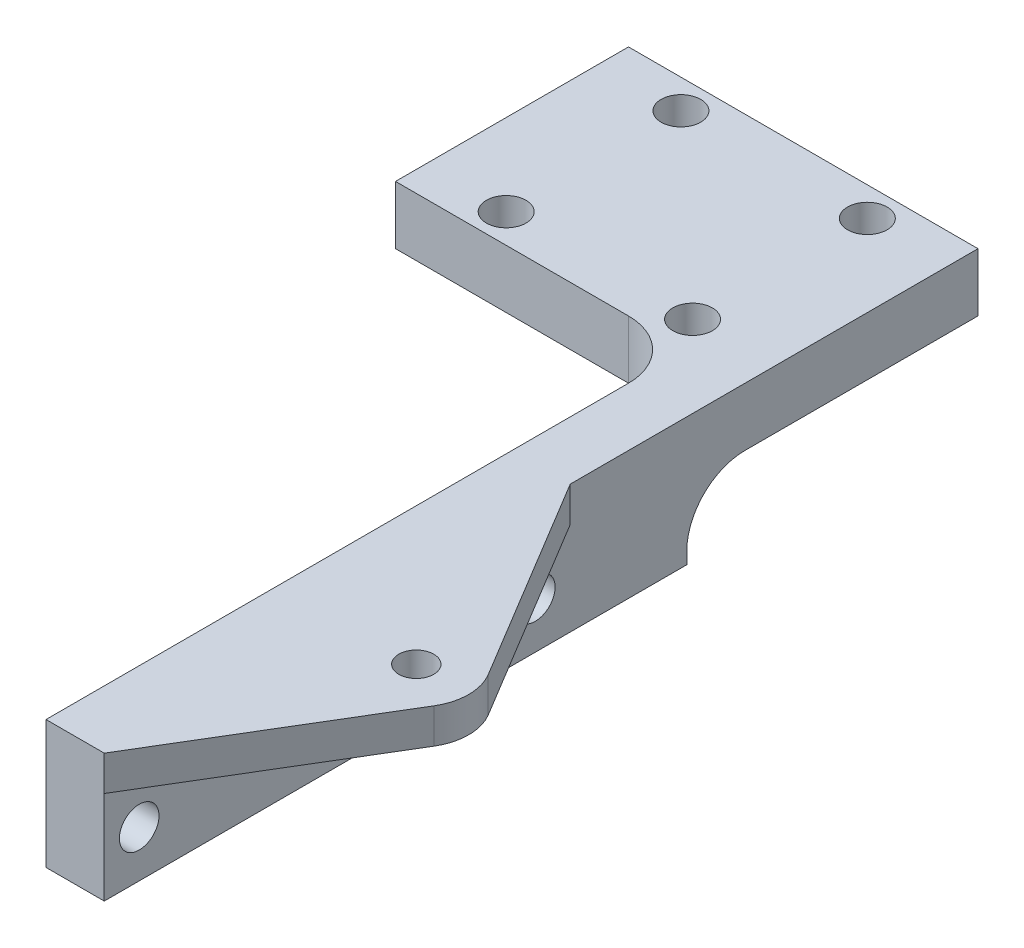
ISO-10303-21;
HEADER;
FILE_DESCRIPTION(('STEP AP214'),'2;1');
FILE_NAME('part.step','',(''),(''),'','','');
FILE_SCHEMA(('AUTOMOTIVE_DESIGN { 1 0 10303 214 1 1 1 1 }'));
ENDSEC;
DATA;
#1=APPLICATION_CONTEXT('core data for automotive mechanical design processes');
#2=APPLICATION_PROTOCOL_DEFINITION('international standard','automotive_design',2000,#1);
#3=PRODUCT_CONTEXT('',#1,'mechanical');
#4=PRODUCT('Part','Part','',(#3));
#5=PRODUCT_RELATED_PRODUCT_CATEGORY('part','',(#4));
#6=PRODUCT_DEFINITION_FORMATION('','',#4);
#7=PRODUCT_DEFINITION_CONTEXT('part definition',#1,'design');
#8=PRODUCT_DEFINITION('design','',#6,#7);
#9=PRODUCT_DEFINITION_SHAPE('','',#8);
#10=(LENGTH_UNIT() NAMED_UNIT(*) SI_UNIT(.MILLI.,.METRE.));
#11=(NAMED_UNIT(*) PLANE_ANGLE_UNIT() SI_UNIT($,.RADIAN.));
#12=(NAMED_UNIT(*) SI_UNIT($,.STERADIAN.) SOLID_ANGLE_UNIT());
#13=UNCERTAINTY_MEASURE_WITH_UNIT(LENGTH_MEASURE(1.E-05),#10,'distance_accuracy_value','');
#14=(GEOMETRIC_REPRESENTATION_CONTEXT(3) GLOBAL_UNCERTAINTY_ASSIGNED_CONTEXT((#13)) GLOBAL_UNIT_ASSIGNED_CONTEXT((#10,
#11,#12)) REPRESENTATION_CONTEXT('',''));
#15=CARTESIAN_POINT('',(0.,0.,0.));
#16=DIRECTION('',(0.,0.,1.));
#17=DIRECTION('',(1.,0.,0.));
#18=AXIS2_PLACEMENT_3D('',#15,#16,#17);
#19=CARTESIAN_POINT('',(5.,10.3579008868023,0.));
#20=DIRECTION('',(0.,1.,0.));
#21=DIRECTION('',(0.,0.,1.));
#22=AXIS2_PLACEMENT_3D('',#19,#20,#21);
#23=PLANE('',#22);
#24=DIRECTION('',(-1.,0.,0.));
#25=VECTOR('',#24,1.);
#26=CARTESIAN_POINT('',(5.,10.3579008868023,-13.0688163423994));
#27=LINE('',#26,#25);
#28=CARTESIAN_POINT('',(5.,10.3579008868023,-13.0688163423994));
#29=VERTEX_POINT('',#28);
#30=CARTESIAN_POINT('',(0.,10.3579008868023,-13.0688163423994));
#31=VERTEX_POINT('',#30);
#32=EDGE_CURVE('E191',#29,#31,#27,.T.);
#33=ORIENTED_EDGE('',*,*,#32,.F.);
#34=DIRECTION('',(0.,0.,-1.));
#35=VECTOR('',#34,1.);
#36=CARTESIAN_POINT('',(5.,10.3579008868023,0.));
#37=LINE('',#36,#35);
#38=CARTESIAN_POINT('',(5.,10.3579008868023,36.9311846261761));
#39=VERTEX_POINT('',#38);
#40=EDGE_CURVE('E278',#39,#29,#37,.T.);
#41=ORIENTED_EDGE('',*,*,#40,.F.);
#42=DIRECTION('',(-1.,0.,0.));
#43=VECTOR('',#42,1.);
#44=CARTESIAN_POINT('',(5.,10.3579008868023,36.9311846261761));
#45=LINE('',#44,#43);
#46=CARTESIAN_POINT('',(0.,10.3579008868023,36.9311846261761));
#47=VERTEX_POINT('',#46);
#48=EDGE_CURVE('E290',#39,#47,#45,.T.);
#49=ORIENTED_EDGE('',*,*,#48,.T.);
#50=DIRECTION('',(0.,0.,-1.));
#51=VECTOR('',#50,1.);
#52=CARTESIAN_POINT('',(0.,10.3579008868023,0.));
#53=LINE('',#52,#51);
#54=EDGE_CURVE('E297',#47,#31,#53,.T.);
#55=ORIENTED_EDGE('',*,*,#54,.T.);
#56=EDGE_LOOP('',(#33,#41,#49,#55));
#57=FACE_BOUND('',#56,.T.);
#58=ADVANCED_FACE('F45',(#57),#23,.F.);
#59=CARTESIAN_POINT('',(5.,21.3579008011206,0.));
#60=DIRECTION('',(0.,1.,0.));
#61=DIRECTION('',(0.,0.,1.));
#62=AXIS2_PLACEMENT_3D('',#59,#60,#61);
#63=PLANE('',#62);
#64=DIRECTION('',(0.,0.,-1.));
#65=VECTOR('',#64,1.);
#66=CARTESIAN_POINT('',(0.,21.3579008011206,0.));
#67=LINE('',#66,#65);
#68=CARTESIAN_POINT('',(0.,21.3579008011206,36.9311846261761));
#69=VERTEX_POINT('',#68);
#70=CARTESIAN_POINT('',(0.,21.3579008011206,-13.0688163423993));
#71=VERTEX_POINT('',#70);
#72=EDGE_CURVE('E266',#69,#71,#67,.T.);
#73=ORIENTED_EDGE('',*,*,#72,.F.);
#74=DIRECTION('',(-1.,0.,0.));
#75=VECTOR('',#74,1.);
#76=CARTESIAN_POINT('',(5.,21.3579008011206,36.9311846261761));
#77=LINE('',#76,#75);
#78=CARTESIAN_POINT('',(5.,21.3579008011206,36.9311846261761));
#79=VERTEX_POINT('',#78);
#80=EDGE_CURVE('E311',#79,#69,#77,.T.);
#81=ORIENTED_EDGE('',*,*,#80,.F.);
#82=DIRECTION('',(-0.515652830219382,0.,0.856797618277935));
#83=VECTOR('',#82,1.);
#84=CARTESIAN_POINT('',(19.9870817863266,21.3579008011206,12.0289728531929));
#85=LINE('',#84,#83);
#86=CARTESIAN_POINT('',(15.6402210901174,21.3579008011206,19.2516228091981));
#87=VERTEX_POINT('',#86);
#88=EDGE_CURVE('E176',#87,#79,#85,.T.);
#89=ORIENTED_EDGE('',*,*,#88,.F.);
#90=CARTESIAN_POINT('',(11.7846318078667,21.3579008011206,16.9311850732109));
#91=DIRECTION('',(0.,1.,0.));
#92=DIRECTION('',(0.,0.,1.));
#93=AXIS2_PLACEMENT_3D('',#90,#91,#92);
#94=CIRCLE('',#93,4.5);
#95=CARTESIAN_POINT('',(15.6402210901174,21.3579008011206,14.6107473372236));
#96=VERTEX_POINT('',#95);
#97=EDGE_CURVE('E143',#87,#96,#94,.T.);
#98=ORIENTED_EDGE('',*,*,#97,.T.);
#99=DIRECTION('',(-0.515652830219382,0.,-0.856797618277935));
#100=VECTOR('',#99,1.);
#101=CARTESIAN_POINT('',(5.02634407714158,21.3579008011206,-3.02504172950877));
#102=LINE('',#101,#100);
#103=CARTESIAN_POINT('',(5.,21.3579008011206,-3.06881447975438));
#104=VERTEX_POINT('',#103);
#105=EDGE_CURVE('E181',#96,#104,#102,.T.);
#106=ORIENTED_EDGE('',*,*,#105,.T.);
#107=DIRECTION('',(0.,0.,-1.));
#108=VECTOR('',#107,1.);
#109=CARTESIAN_POINT('',(5.,21.3579008011206,0.));
#110=LINE('',#109,#108);
#111=CARTESIAN_POINT('',(5.,21.3579008011206,-38.0688163423991));
#112=VERTEX_POINT('',#111);
#113=EDGE_CURVE('E68',#104,#112,#110,.T.);
#114=ORIENTED_EDGE('',*,*,#113,.T.);
#115=DIRECTION('',(-1.,0.,0.));
#116=VECTOR('',#115,1.);
#117=CARTESIAN_POINT('',(0.,21.3579008011206,-38.0688163423991));
#118=LINE('',#117,#116);
#119=CARTESIAN_POINT('',(-25.0000000000003,21.3579008011206,-38.0688163423991));
#120=VERTEX_POINT('',#119);
#121=EDGE_CURVE('E252',#112,#120,#118,.T.);
#122=ORIENTED_EDGE('',*,*,#121,.T.);
#123=DIRECTION('',(0.,0.,1.));
#124=VECTOR('',#123,1.);
#125=CARTESIAN_POINT('',(-24.9999999999999,21.3579008011206,2.60208521396519E-13));
#126=LINE('',#125,#124);
#127=CARTESIAN_POINT('',(-25.,21.3579008011206,-18.068816342399));
#128=VERTEX_POINT('',#127);
#129=EDGE_CURVE('E256',#120,#128,#126,.T.);
#130=ORIENTED_EDGE('',*,*,#129,.T.);
#131=DIRECTION('',(1.,0.,0.));
#132=VECTOR('',#131,1.);
#133=CARTESIAN_POINT('',(-1.9224565267261E-13,21.3579008011206,-18.0688163423993));
#134=LINE('',#133,#132);
#135=CARTESIAN_POINT('',(-5.00000000000005,21.3579008011206,-18.0688163423993));
#136=VERTEX_POINT('',#135);
#137=EDGE_CURVE('E209',#128,#136,#134,.T.);
#138=ORIENTED_EDGE('',*,*,#137,.T.);
#139=CARTESIAN_POINT('',(-5.,21.3579008011206,-13.0688163423993));
#140=DIRECTION('',(0.,1.,0.));
#141=DIRECTION('',(0.,0.,1.));
#142=AXIS2_PLACEMENT_3D('',#139,#140,#141);
#143=CIRCLE('',#142,5.);
#144=EDGE_CURVE('E11',#136,#71,#143,.F.);
#145=ORIENTED_EDGE('',*,*,#144,.T.);
#146=EDGE_LOOP('',(#73,#81,#89,#98,#106,#114,#122,#130,#138,#145));
#147=FACE_BOUND('',#146,.T.);
#148=CARTESIAN_POINT('',(-18.0000000000002,21.3579008011206,-35.5688163423991));
#149=DIRECTION('',(0.,1.,0.));
#150=DIRECTION('',(0.,0.,1.));
#151=AXIS2_PLACEMENT_3D('',#148,#149,#150);
#152=CIRCLE('',#151,1.7);
#153=CARTESIAN_POINT('',(-18.0000000000002,21.3579008011206,-33.8688163423991));
#154=VERTEX_POINT('',#153);
#155=EDGE_CURVE('E203',#154,#154,#152,.T.);
#156=ORIENTED_EDGE('',*,*,#155,.F.);
#157=EDGE_LOOP('',(#156));
#158=FACE_BOUND('',#157,.T.);
#159=CARTESIAN_POINT('',(-18.0000000000001,21.3579008011206,-20.5688163423991));
#160=DIRECTION('',(0.,1.,0.));
#161=DIRECTION('',(0.,0.,1.));
#162=AXIS2_PLACEMENT_3D('',#159,#160,#161);
#163=CIRCLE('',#162,1.7);
#164=CARTESIAN_POINT('',(-18.0000000000001,21.3579008011206,-18.8688163423991));
#165=VERTEX_POINT('',#164);
#166=EDGE_CURVE('E240',#165,#165,#163,.T.);
#167=ORIENTED_EDGE('',*,*,#166,.F.);
#168=EDGE_LOOP('',(#167));
#169=FACE_BOUND('',#168,.T.);
#170=CARTESIAN_POINT('',(-2.0000000000002,21.3579008011206,-35.5688163423993));
#171=DIRECTION('',(0.,1.,0.));
#172=DIRECTION('',(0.,0.,1.));
#173=AXIS2_PLACEMENT_3D('',#170,#171,#172);
#174=CIRCLE('',#173,1.7);
#175=CARTESIAN_POINT('',(-2.0000000000002,21.3579008011206,-33.8688163423993));
#176=VERTEX_POINT('',#175);
#177=EDGE_CURVE('E244',#176,#176,#174,.T.);
#178=ORIENTED_EDGE('',*,*,#177,.F.);
#179=EDGE_LOOP('',(#178));
#180=FACE_BOUND('',#179,.T.);
#181=CARTESIAN_POINT('',(-2.00000000000005,21.3579008011206,-20.5688163423993));
#182=DIRECTION('',(0.,1.,0.));
#183=DIRECTION('',(0.,0.,1.));
#184=AXIS2_PLACEMENT_3D('',#181,#182,#183);
#185=CIRCLE('',#184,1.7);
#186=CARTESIAN_POINT('',(-2.00000000000005,21.3579008011206,-18.8688163423993));
#187=VERTEX_POINT('',#186);
#188=EDGE_CURVE('E248',#187,#187,#185,.T.);
#189=ORIENTED_EDGE('',*,*,#188,.F.);
#190=EDGE_LOOP('',(#189));
#191=FACE_BOUND('',#190,.T.);
#192=CARTESIAN_POINT('',(11.7846318078667,21.3579008011206,16.9311850732109));
#193=DIRECTION('',(0.,1.,0.));
#194=DIRECTION('',(0.,0.,1.));
#195=AXIS2_PLACEMENT_3D('',#192,#193,#194);
#196=CIRCLE('',#195,1.5);
#197=CARTESIAN_POINT('',(11.7846318078667,21.3579008011206,18.4311850732109));
#198=VERTEX_POINT('',#197);
#199=EDGE_CURVE('E159',#198,#198,#196,.T.);
#200=ORIENTED_EDGE('',*,*,#199,.F.);
#201=EDGE_LOOP('',(#200));
#202=FACE_BOUND('',#201,.T.);
#203=ADVANCED_FACE('F342',(#147,#158,#169,#180,#191,#202),#63,.T.);
#204=CARTESIAN_POINT('',(5.,0.,36.9311846261761));
#205=DIRECTION('',(0.,0.,-1.));
#206=DIRECTION('',(-1.,0.,0.));
#207=AXIS2_PLACEMENT_3D('',#204,#205,#206);
#208=PLANE('',#207);
#209=DIRECTION('',(0.,-1.,0.));
#210=VECTOR('',#209,1.);
#211=CARTESIAN_POINT('',(0.,0.,36.9311846261761));
#212=LINE('',#211,#210);
#213=EDGE_CURVE('E294',#69,#47,#212,.T.);
#214=ORIENTED_EDGE('',*,*,#213,.T.);
#215=ORIENTED_EDGE('',*,*,#48,.F.);
#216=DIRECTION('',(0.,-1.,0.));
#217=VECTOR('',#216,1.);
#218=CARTESIAN_POINT('',(5.,0.,36.9311846261761));
#219=LINE('',#218,#217);
#220=CARTESIAN_POINT('',(5.,18.3579008011206,36.9311846261761));
#221=VERTEX_POINT('',#220);
#222=EDGE_CURVE('E274',#221,#39,#219,.T.);
#223=ORIENTED_EDGE('',*,*,#222,.F.);
#224=EDGE_CURVE('E156',#79,#221,#219,.T.);
#225=ORIENTED_EDGE('',*,*,#224,.F.);
#226=ORIENTED_EDGE('',*,*,#80,.T.);
#227=EDGE_LOOP('',(#214,#215,#223,#225,#226));
#228=FACE_BOUND('',#227,.T.);
#229=ADVANCED_FACE('F345',(#228),#208,.F.);
#230=CARTESIAN_POINT('',(5.,14.3579008011205,33.9311850732109));
#231=DIRECTION('',(-1.,0.,0.));
#232=DIRECTION('',(0.,0.,1.));
#233=AXIS2_PLACEMENT_3D('',#230,#231,#232);
#234=CYLINDRICAL_SURFACE('',#233,1.7);
#235=CARTESIAN_POINT('',(5.,14.3579008011205,33.9311850732109));
#236=DIRECTION('',(1.,0.,0.));
#237=DIRECTION('',(0.,0.,-1.));
#238=AXIS2_PLACEMENT_3D('',#235,#236,#237);
#239=CIRCLE('',#238,1.7);
#240=CARTESIAN_POINT('',(5.,14.3579008011205,32.2311850732109));
#241=VERTEX_POINT('',#240);
#242=EDGE_CURVE('E282',#241,#241,#239,.T.);
#243=ORIENTED_EDGE('',*,*,#242,.T.);
#244=EDGE_LOOP('',(#243));
#245=FACE_BOUND('',#244,.T.);
#246=CARTESIAN_POINT('',(0.,14.3579008011205,33.9311850732109));
#247=DIRECTION('',(1.,0.,0.));
#248=DIRECTION('',(0.,0.,-1.));
#249=AXIS2_PLACEMENT_3D('',#246,#247,#248);
#250=CIRCLE('',#249,1.7);
#251=CARTESIAN_POINT('',(0.,14.3579008011205,32.2311850732109));
#252=VERTEX_POINT('',#251);
#253=EDGE_CURVE('E301',#252,#252,#250,.T.);
#254=ORIENTED_EDGE('',*,*,#253,.F.);
#255=EDGE_LOOP('',(#254));
#256=FACE_BOUND('',#255,.T.);
#257=ADVANCED_FACE('F349',(#245,#256),#234,.F.);
#258=CARTESIAN_POINT('',(5.,14.3579008011207,-0.0688149267891319));
#259=DIRECTION('',(-1.,0.,0.));
#260=DIRECTION('',(0.,0.,1.));
#261=AXIS2_PLACEMENT_3D('',#258,#259,#260);
#262=CYLINDRICAL_SURFACE('',#261,1.7);
#263=CARTESIAN_POINT('',(5.,14.3579008011207,-0.0688149267891319));
#264=DIRECTION('',(1.,0.,0.));
#265=DIRECTION('',(0.,0.,-1.));
#266=AXIS2_PLACEMENT_3D('',#263,#264,#265);
#267=CIRCLE('',#266,1.7);
#268=CARTESIAN_POINT('',(5.,14.3579008011207,-1.76881492678913));
#269=VERTEX_POINT('',#268);
#270=EDGE_CURVE('E286',#269,#269,#267,.T.);
#271=ORIENTED_EDGE('',*,*,#270,.T.);
#272=EDGE_LOOP('',(#271));
#273=FACE_BOUND('',#272,.T.);
#274=CARTESIAN_POINT('',(0.,14.3579008011207,-0.0688149267891319));
#275=DIRECTION('',(1.,0.,0.));
#276=DIRECTION('',(0.,0.,-1.));
#277=AXIS2_PLACEMENT_3D('',#274,#275,#276);
#278=CIRCLE('',#277,1.7);
#279=CARTESIAN_POINT('',(0.,14.3579008011207,-1.76881492678913));
#280=VERTEX_POINT('',#279);
#281=EDGE_CURVE('E275',#280,#280,#278,.T.);
#282=ORIENTED_EDGE('',*,*,#281,.F.);
#283=EDGE_LOOP('',(#282));
#284=FACE_BOUND('',#283,.T.);
#285=ADVANCED_FACE('F356',(#273,#284),#262,.F.);
#286=CARTESIAN_POINT('',(5.,0.,0.));
#287=DIRECTION('',(1.,0.,0.));
#288=DIRECTION('',(0.,0.,-1.));
#289=AXIS2_PLACEMENT_3D('',#286,#287,#288);
#290=PLANE('',#289);
#291=DIRECTION('',(0.,1.,0.));
#292=VECTOR('',#291,1.);
#293=CARTESIAN_POINT('',(5.,18.3579008011206,-3.06881447975438));
#294=LINE('',#293,#292);
#295=CARTESIAN_POINT('',(5.,18.3579008011206,-3.06881447975438));
#296=VERTEX_POINT('',#295);
#297=EDGE_CURVE('E188',#296,#104,#294,.T.);
#298=ORIENTED_EDGE('',*,*,#297,.F.);
#299=DIRECTION('',(0.,0.,-1.));
#300=VECTOR('',#299,1.);
#301=CARTESIAN_POINT('',(5.,18.3579008011206,0.));
#302=LINE('',#301,#300);
#303=EDGE_CURVE('E62',#221,#296,#302,.T.);
#304=ORIENTED_EDGE('',*,*,#303,.F.);
#305=ORIENTED_EDGE('',*,*,#222,.T.);
#306=ORIENTED_EDGE('',*,*,#40,.T.);
#307=DIRECTION('',(0.,-1.,0.));
#308=VECTOR('',#307,1.);
#309=CARTESIAN_POINT('',(5.,16.3579008011206,-13.0688163423994));
#310=LINE('',#309,#308);
#311=CARTESIAN_POINT('',(5.,11.3579008011206,-13.0688163423994));
#312=VERTEX_POINT('',#311);
#313=EDGE_CURVE('E200',#312,#29,#310,.T.);
#314=ORIENTED_EDGE('',*,*,#313,.F.);
#315=CARTESIAN_POINT('',(5.,11.3579008011206,-18.0688163423994));
#316=DIRECTION('',(1.,0.,0.));
#317=DIRECTION('',(0.,0.,-1.));
#318=AXIS2_PLACEMENT_3D('',#315,#316,#317);
#319=CIRCLE('',#318,5.);
#320=CARTESIAN_POINT('',(5.,16.3579008011206,-18.0688163423994));
#321=VERTEX_POINT('',#320);
#322=EDGE_CURVE('E321',#312,#321,#319,.F.);
#323=ORIENTED_EDGE('',*,*,#322,.T.);
#324=DIRECTION('',(0.,0.,-1.));
#325=VECTOR('',#324,1.);
#326=CARTESIAN_POINT('',(5.,16.3579008011206,0.));
#327=LINE('',#326,#325);
#328=CARTESIAN_POINT('',(5.,16.3579008011206,-38.0688163423991));
#329=VERTEX_POINT('',#328);
#330=EDGE_CURVE('E221',#321,#329,#327,.T.);
#331=ORIENTED_EDGE('',*,*,#330,.T.);
#332=DIRECTION('',(0.,1.,0.));
#333=VECTOR('',#332,1.);
#334=CARTESIAN_POINT('',(5.,16.3579008011206,-38.0688163423991));
#335=LINE('',#334,#333);
#336=EDGE_CURVE('E236',#329,#112,#335,.T.);
#337=ORIENTED_EDGE('',*,*,#336,.T.);
#338=ORIENTED_EDGE('',*,*,#113,.F.);
#339=EDGE_LOOP('',(#298,#304,#305,#306,#314,#323,#331,#337,#338));
#340=FACE_BOUND('',#339,.T.);
#341=ORIENTED_EDGE('',*,*,#242,.F.);
#342=EDGE_LOOP('',(#341));
#343=FACE_BOUND('',#342,.T.);
#344=ORIENTED_EDGE('',*,*,#270,.F.);
#345=EDGE_LOOP('',(#344));
#346=FACE_BOUND('',#345,.T.);
#347=ADVANCED_FACE('F360',(#340,#343,#346),#290,.T.);
#348=CARTESIAN_POINT('',(0.,0.,0.));
#349=DIRECTION('',(1.,0.,0.));
#350=DIRECTION('',(0.,0.,-1.));
#351=AXIS2_PLACEMENT_3D('',#348,#349,#350);
#352=PLANE('',#351);
#353=ORIENTED_EDGE('',*,*,#72,.T.);
#354=DIRECTION('',(0.,-1.,0.));
#355=VECTOR('',#354,1.);
#356=CARTESIAN_POINT('',(0.,0.,-13.0688163423993));
#357=LINE('',#356,#355);
#358=CARTESIAN_POINT('',(0.,11.3579008011206,-13.0688163423994));
#359=VERTEX_POINT('',#358);
#360=EDGE_CURVE('E324',#71,#359,#357,.T.);
#361=ORIENTED_EDGE('',*,*,#360,.T.);
#362=DIRECTION('',(0.,1.,0.));
#363=VECTOR('',#362,1.);
#364=CARTESIAN_POINT('',(0.,10.3579008868023,-13.0688163423994));
#365=LINE('',#364,#363);
#366=EDGE_CURVE('E196',#31,#359,#365,.T.);
#367=ORIENTED_EDGE('',*,*,#366,.F.);
#368=ORIENTED_EDGE('',*,*,#54,.F.);
#369=ORIENTED_EDGE('',*,*,#213,.F.);
#370=EDGE_LOOP('',(#353,#361,#367,#368,#369));
#371=FACE_BOUND('',#370,.T.);
#372=ORIENTED_EDGE('',*,*,#253,.T.);
#373=EDGE_LOOP('',(#372));
#374=FACE_BOUND('',#373,.T.);
#375=ORIENTED_EDGE('',*,*,#281,.T.);
#376=EDGE_LOOP('',(#375));
#377=FACE_BOUND('',#376,.T.);
#378=ADVANCED_FACE('F362',(#371,#374,#377),#352,.F.);
#379=CARTESIAN_POINT('',(-1.9224565267261E-13,16.3579008011206,-18.0688163423993));
#380=DIRECTION('',(0.,0.,1.));
#381=DIRECTION('',(1.,0.,0.));
#382=AXIS2_PLACEMENT_3D('',#379,#380,#381);
#383=PLANE('',#382);
#384=DIRECTION('',(1.,0.,0.));
#385=VECTOR('',#384,1.);
#386=CARTESIAN_POINT('',(-1.9224565267261E-13,16.3579008011206,-18.0688163423993));
#387=LINE('',#386,#385);
#388=CARTESIAN_POINT('',(-25.,16.3579008011206,-18.068816342399));
#389=VERTEX_POINT('',#388);
#390=CARTESIAN_POINT('',(-5.00000000000005,16.3579008011206,-18.0688163423993));
#391=VERTEX_POINT('',#390);
#392=EDGE_CURVE('E232',#389,#391,#387,.T.);
#393=ORIENTED_EDGE('',*,*,#392,.T.);
#394=DIRECTION('',(0.,-1.,0.));
#395=VECTOR('',#394,1.);
#396=CARTESIAN_POINT('',(-5.00000000000005,16.3579008011206,-18.0688163423993));
#397=LINE('',#396,#395);
#398=EDGE_CURVE('E328',#391,#136,#397,.F.);
#399=ORIENTED_EDGE('',*,*,#398,.T.);
#400=ORIENTED_EDGE('',*,*,#137,.F.);
#401=DIRECTION('',(0.,1.,0.));
#402=VECTOR('',#401,1.);
#403=CARTESIAN_POINT('',(-25.,16.3579008011206,-18.068816342399));
#404=LINE('',#403,#402);
#405=EDGE_CURVE('E263',#389,#128,#404,.T.);
#406=ORIENTED_EDGE('',*,*,#405,.F.);
#407=EDGE_LOOP('',(#393,#399,#400,#406));
#408=FACE_BOUND('',#407,.T.);
#409=ADVANCED_FACE('F365',(#408),#383,.T.);
#410=CARTESIAN_POINT('',(-24.9999999999999,16.3579008011206,2.60208521396519E-13));
#411=DIRECTION('',(-1.,0.,0.));
#412=DIRECTION('',(0.,0.,1.));
#413=AXIS2_PLACEMENT_3D('',#410,#411,#412);
#414=PLANE('',#413);
#415=ORIENTED_EDGE('',*,*,#129,.F.);
#416=DIRECTION('',(0.,1.,0.));
#417=VECTOR('',#416,1.);
#418=CARTESIAN_POINT('',(-25.0000000000003,16.3579008011206,-38.0688163423991));
#419=LINE('',#418,#417);
#420=CARTESIAN_POINT('',(-25.0000000000003,16.3579008011206,-38.0688163423991));
#421=VERTEX_POINT('',#420);
#422=EDGE_CURVE('E267',#421,#120,#419,.T.);
#423=ORIENTED_EDGE('',*,*,#422,.F.);
#424=DIRECTION('',(0.,0.,1.));
#425=VECTOR('',#424,1.);
#426=CARTESIAN_POINT('',(-24.9999999999999,16.3579008011206,2.60208521396519E-13));
#427=LINE('',#426,#425);
#428=EDGE_CURVE('E228',#421,#389,#427,.T.);
#429=ORIENTED_EDGE('',*,*,#428,.T.);
#430=ORIENTED_EDGE('',*,*,#405,.T.);
#431=EDGE_LOOP('',(#415,#423,#429,#430));
#432=FACE_BOUND('',#431,.T.);
#433=ADVANCED_FACE('F385',(#432),#414,.T.);
#434=CARTESIAN_POINT('',(-2.00000000000005,16.3579008011206,-20.5688163423993));
#435=DIRECTION('',(0.,1.,0.));
#436=DIRECTION('',(0.,0.,1.));
#437=AXIS2_PLACEMENT_3D('',#434,#435,#436);
#438=CYLINDRICAL_SURFACE('',#437,1.7);
#439=CARTESIAN_POINT('',(-2.00000000000005,16.3579008011206,-20.5688163423993));
#440=DIRECTION('',(0.,1.,0.));
#441=DIRECTION('',(0.,0.,1.));
#442=AXIS2_PLACEMENT_3D('',#439,#440,#441);
#443=CIRCLE('',#442,1.7);
#444=CARTESIAN_POINT('',(-2.00000000000005,16.3579008011206,-18.8688163423993));
#445=VERTEX_POINT('',#444);
#446=EDGE_CURVE('E217',#445,#445,#443,.T.);
#447=ORIENTED_EDGE('',*,*,#446,.F.);
#448=EDGE_LOOP('',(#447));
#449=FACE_BOUND('',#448,.T.);
#450=ORIENTED_EDGE('',*,*,#188,.T.);
#451=EDGE_LOOP('',(#450));
#452=FACE_BOUND('',#451,.T.);
#453=ADVANCED_FACE('F381',(#449,#452),#438,.F.);
#454=CARTESIAN_POINT('',(-2.0000000000002,16.3579008011206,-35.5688163423993));
#455=DIRECTION('',(0.,1.,0.));
#456=DIRECTION('',(0.,0.,1.));
#457=AXIS2_PLACEMENT_3D('',#454,#455,#456);
#458=CYLINDRICAL_SURFACE('',#457,1.7);
#459=CARTESIAN_POINT('',(-2.0000000000002,16.3579008011206,-35.5688163423993));
#460=DIRECTION('',(0.,1.,0.));
#461=DIRECTION('',(0.,0.,1.));
#462=AXIS2_PLACEMENT_3D('',#459,#460,#461);
#463=CIRCLE('',#462,1.7);
#464=CARTESIAN_POINT('',(-2.0000000000002,16.3579008011206,-33.8688163423993));
#465=VERTEX_POINT('',#464);
#466=EDGE_CURVE('E213',#465,#465,#463,.T.);
#467=ORIENTED_EDGE('',*,*,#466,.F.);
#468=EDGE_LOOP('',(#467));
#469=FACE_BOUND('',#468,.T.);
#470=ORIENTED_EDGE('',*,*,#177,.T.);
#471=EDGE_LOOP('',(#470));
#472=FACE_BOUND('',#471,.T.);
#473=ADVANCED_FACE('F377',(#469,#472),#458,.F.);
#474=CARTESIAN_POINT('',(-18.0000000000001,16.3579008011206,-20.5688163423991));
#475=DIRECTION('',(0.,1.,0.));
#476=DIRECTION('',(0.,0.,1.));
#477=AXIS2_PLACEMENT_3D('',#474,#475,#476);
#478=CYLINDRICAL_SURFACE('',#477,1.7);
#479=CARTESIAN_POINT('',(-18.0000000000001,16.3579008011206,-20.5688163423991));
#480=DIRECTION('',(0.,1.,0.));
#481=DIRECTION('',(0.,0.,1.));
#482=AXIS2_PLACEMENT_3D('',#479,#480,#481);
#483=CIRCLE('',#482,1.7);
#484=CARTESIAN_POINT('',(-18.0000000000001,16.3579008011206,-18.8688163423991));
#485=VERTEX_POINT('',#484);
#486=EDGE_CURVE('E208',#485,#485,#483,.T.);
#487=ORIENTED_EDGE('',*,*,#486,.F.);
#488=EDGE_LOOP('',(#487));
#489=FACE_BOUND('',#488,.T.);
#490=ORIENTED_EDGE('',*,*,#166,.T.);
#491=EDGE_LOOP('',(#490));
#492=FACE_BOUND('',#491,.T.);
#493=ADVANCED_FACE('F373',(#489,#492),#478,.F.);
#494=CARTESIAN_POINT('',(-18.0000000000002,16.3579008011206,-35.5688163423991));
#495=DIRECTION('',(0.,1.,0.));
#496=DIRECTION('',(0.,0.,1.));
#497=AXIS2_PLACEMENT_3D('',#494,#495,#496);
#498=CYLINDRICAL_SURFACE('',#497,1.7);
#499=CARTESIAN_POINT('',(-18.0000000000002,16.3579008011206,-35.5688163423991));
#500=DIRECTION('',(0.,1.,0.));
#501=DIRECTION('',(0.,0.,1.));
#502=AXIS2_PLACEMENT_3D('',#499,#500,#501);
#503=CIRCLE('',#502,1.7);
#504=CARTESIAN_POINT('',(-18.0000000000002,16.3579008011206,-33.8688163423991));
#505=VERTEX_POINT('',#504);
#506=EDGE_CURVE('E204',#505,#505,#503,.T.);
#507=ORIENTED_EDGE('',*,*,#506,.F.);
#508=EDGE_LOOP('',(#507));
#509=FACE_BOUND('',#508,.T.);
#510=ORIENTED_EDGE('',*,*,#155,.T.);
#511=EDGE_LOOP('',(#510));
#512=FACE_BOUND('',#511,.T.);
#513=ADVANCED_FACE('F369',(#509,#512),#498,.F.);
#514=CARTESIAN_POINT('',(0.,16.3579008011206,-38.0688163423991));
#515=DIRECTION('',(0.,0.,-1.));
#516=DIRECTION('',(-1.,0.,0.));
#517=AXIS2_PLACEMENT_3D('',#514,#515,#516);
#518=PLANE('',#517);
#519=ORIENTED_EDGE('',*,*,#121,.F.);
#520=ORIENTED_EDGE('',*,*,#336,.F.);
#521=DIRECTION('',(-1.,0.,0.));
#522=VECTOR('',#521,1.);
#523=CARTESIAN_POINT('',(0.,16.3579008011206,-38.0688163423991));
#524=LINE('',#523,#522);
#525=EDGE_CURVE('E224',#329,#421,#524,.T.);
#526=ORIENTED_EDGE('',*,*,#525,.T.);
#527=ORIENTED_EDGE('',*,*,#422,.T.);
#528=EDGE_LOOP('',(#519,#520,#526,#527));
#529=FACE_BOUND('',#528,.T.);
#530=ADVANCED_FACE('F372',(#529),#518,.T.);
#531=CARTESIAN_POINT('',(0.,16.3579008011206,0.));
#532=DIRECTION('',(0.,1.,0.));
#533=DIRECTION('',(0.,0.,1.));
#534=AXIS2_PLACEMENT_3D('',#531,#532,#533);
#535=PLANE('',#534);
#536=ORIENTED_EDGE('',*,*,#506,.T.);
#537=EDGE_LOOP('',(#536));
#538=FACE_BOUND('',#537,.T.);
#539=ORIENTED_EDGE('',*,*,#486,.T.);
#540=EDGE_LOOP('',(#539));
#541=FACE_BOUND('',#540,.T.);
#542=ORIENTED_EDGE('',*,*,#466,.T.);
#543=EDGE_LOOP('',(#542));
#544=FACE_BOUND('',#543,.T.);
#545=ORIENTED_EDGE('',*,*,#446,.T.);
#546=EDGE_LOOP('',(#545));
#547=FACE_BOUND('',#546,.T.);
#548=ORIENTED_EDGE('',*,*,#330,.F.);
#549=DIRECTION('',(1.,0.,0.));
#550=VECTOR('',#549,1.);
#551=CARTESIAN_POINT('',(0.,16.3579008011206,-18.0688163423994));
#552=LINE('',#551,#550);
#553=EDGE_CURVE('E318',#321,#391,#552,.F.);
#554=ORIENTED_EDGE('',*,*,#553,.T.);
#555=ORIENTED_EDGE('',*,*,#392,.F.);
#556=ORIENTED_EDGE('',*,*,#428,.F.);
#557=ORIENTED_EDGE('',*,*,#525,.F.);
#558=EDGE_LOOP('',(#548,#554,#555,#556,#557));
#559=FACE_BOUND('',#558,.T.);
#560=ADVANCED_FACE('F389',(#538,#541,#544,#547,#559),#535,.F.);
#561=CARTESIAN_POINT('',(0.,0.,-13.0688163423994));
#562=DIRECTION('',(0.,0.,-1.));
#563=DIRECTION('',(-1.,0.,0.));
#564=AXIS2_PLACEMENT_3D('',#561,#562,#563);
#565=PLANE('',#564);
#566=ORIENTED_EDGE('',*,*,#366,.T.);
#567=DIRECTION('',(1.,0.,0.));
#568=VECTOR('',#567,1.);
#569=CARTESIAN_POINT('',(0.,11.3579008011206,-13.0688163423994));
#570=LINE('',#569,#568);
#571=EDGE_CURVE('E314',#359,#312,#570,.T.);
#572=ORIENTED_EDGE('',*,*,#571,.T.);
#573=ORIENTED_EDGE('',*,*,#313,.T.);
#574=ORIENTED_EDGE('',*,*,#32,.T.);
#575=EDGE_LOOP('',(#566,#572,#573,#574));
#576=FACE_BOUND('',#575,.T.);
#577=ADVANCED_FACE('F340',(#576),#565,.T.);
#578=CARTESIAN_POINT('',(0.,11.3579008011206,-18.0688163423994));
#579=DIRECTION('',(1.,0.,0.));
#580=DIRECTION('',(0.,0.,-1.));
#581=AXIS2_PLACEMENT_3D('',#578,#579,#580);
#582=CYLINDRICAL_SURFACE('',#581,5.);
#583=ORIENTED_EDGE('',*,*,#571,.F.);
#584=CARTESIAN_POINT('',(0.,11.3579008011206,-13.0688163423993));
#585=CARTESIAN_POINT('',(-4.29107106879563E-05,11.4970887798941,-13.0688018410584));
#586=CARTESIAN_POINT('',(-1.35117265747557E-06,11.6362747239982,-13.074627732237));
#587=CARTESIAN_POINT('',(-5.9378767717962E-05,11.9136766511507,-13.0978559744062));
#588=CARTESIAN_POINT('',(-0.000158965041484809,12.0518926400993,-13.1152582549171));
#589=CARTESIAN_POINT('',(-0.000809936346864756,12.3266318709788,-13.1615756476119));
#590=CARTESIAN_POINT('',(-0.00136211567450073,12.4631517082466,-13.1905109542358));
#591=CARTESIAN_POINT('',(-0.00352386214600285,12.733288162258,-13.2596848258851));
#592=CARTESIAN_POINT('',(-0.0051334156089314,12.8669048165415,-13.2999232446604));
#593=CARTESIAN_POINT('',(-0.0102106169554612,13.1304308433127,-13.3914649877889));
#594=CARTESIAN_POINT('',(-0.0136803760695081,13.2603358264625,-13.4427808448136));
#595=CARTESIAN_POINT('',(-0.0234718467102552,13.5153082756139,-13.5560511048308));
#596=CARTESIAN_POINT('',(-0.0297933802708622,13.6403760429551,-13.6180048438126));
#597=CARTESIAN_POINT('',(-0.0464312287516915,13.8846127339569,-13.7519760041242));
#598=CARTESIAN_POINT('',(-0.0567445869386215,14.0037859501841,-13.8239859516734));
#599=CARTESIAN_POINT('',(-0.0826304640818991,14.2353293165119,-13.9774002057742));
#600=CARTESIAN_POINT('',(-0.0982026456259189,14.347699902532,-14.0588039093908));
#601=CARTESIAN_POINT('',(-0.135196214838754,14.5604114230194,-14.2267380192386));
#602=CARTESIAN_POINT('',(-0.15636646309466,14.6610502898677,-14.3129457487834));
#603=CARTESIAN_POINT('',(-0.205950932422291,14.8542452746928,-14.4920965440301));
#604=CARTESIAN_POINT('',(-0.234364987569297,14.9468015777413,-14.5850394554228));
#605=CARTESIAN_POINT('',(-0.299457833611119,15.1229226159355,-14.7761765842569));
#606=CARTESIAN_POINT('',(-0.33612609010387,15.2064986130622,-14.8743639876615));
#607=CARTESIAN_POINT('',(-0.418611457280053,15.3641457265509,-15.0744525280525));
#608=CARTESIAN_POINT('',(-0.464426975693009,15.438218493466,-15.1763530161794));
#609=CARTESIAN_POINT('',(-0.558866966617325,15.5670498345995,-15.3679780667019));
#610=CARTESIAN_POINT('',(-0.606257834913856,15.6230648554463,-15.4574695427839));
#611=CARTESIAN_POINT('',(-0.708457634707474,15.7276675230514,-15.6365562488926));
#612=CARTESIAN_POINT('',(-0.763266137060836,15.776255599146,-15.7261514726199));
#613=CARTESIAN_POINT('',(-0.880273006318085,15.8661405216048,-15.9041637946517));
#614=CARTESIAN_POINT('',(-0.942471585288774,15.907437158648,-15.9925808590666));
#615=CARTESIAN_POINT('',(-1.07404708141287,15.9830695245902,-16.1670137818695));
#616=CARTESIAN_POINT('',(-1.14342404062073,16.0174052127049,-16.2530296261862));
#617=CARTESIAN_POINT('',(-1.28474935428931,16.0778018503306,-16.4166382250088));
#618=CARTESIAN_POINT('',(-1.35631274884951,16.1042282102334,-16.4944298009549));
#619=CARTESIAN_POINT('',(-1.50511754001706,16.1518817313983,-16.6461181682482));
#620=CARTESIAN_POINT('',(-1.58236074317832,16.1731072290619,-16.7200137074546));
#621=CARTESIAN_POINT('',(-1.7420455061522,16.21093440256,-16.8631846427463));
#622=CARTESIAN_POINT('',(-1.82448603296605,16.2275369936933,-16.9324609513338));
#623=CARTESIAN_POINT('',(-1.99413799571562,16.2567543520871,-17.0658708820337));
#624=CARTESIAN_POINT('',(-2.08135115815713,16.2693676648855,-17.1300026221276));
#625=CARTESIAN_POINT('',(-2.26884878591685,16.2923072757874,-17.2586828995308));
#626=CARTESIAN_POINT('',(-2.36957468776464,16.3022860149847,-17.322650498464));
#627=CARTESIAN_POINT('',(-2.57558415533016,16.3189989810242,-17.4433412935917));
#628=CARTESIAN_POINT('',(-2.68086970642421,16.3257317787096,-17.5000612906738));
#629=CARTESIAN_POINT('',(-2.8953939258256,16.3367080776796,-17.6058798495982));
#630=CARTESIAN_POINT('',(-3.0046346369265,16.3409502725496,-17.6549744016966));
#631=CARTESIAN_POINT('',(-3.22640691542388,16.3476231124228,-17.7452147455582));
#632=CARTESIAN_POINT('',(-3.33893868328846,16.3500536468325,-17.7863600519429));
#633=CARTESIAN_POINT('',(-3.5774731729528,16.353868885106,-17.8639805683379));
#634=CARTESIAN_POINT('',(-3.70374247526415,16.355132766201,-17.8996446465107));
#635=CARTESIAN_POINT('',(-3.95870605058789,16.3568304017301,-17.9609429958364));
#636=CARTESIAN_POINT('',(-4.08740053848024,16.357264082253,-17.9865763738126));
#637=CARTESIAN_POINT('',(-4.34634600369384,16.3577758759908,-18.0276372030709));
#638=CARTESIAN_POINT('',(-4.47659621715281,16.3578541570487,-18.0430694690446));
#639=CARTESIAN_POINT('',(-4.737897279145,16.3578997104522,-18.0636644555178));
#640=CARTESIAN_POINT('',(-4.86894807483854,16.3578669900467,-18.0688278465883));
#641=CARTESIAN_POINT('',(-5.00000000000009,16.3579008011206,-18.0688163423993));
#642=B_SPLINE_CURVE_WITH_KNOTS('',3,(#584,#585,#586,#587,#588,#589,#590,#591,#592,#593,#594,
#595,#596,#597,#598,#599,#600,#601,#602,#603,#604,#605,#606,#607,#608,#609,#610,#611,#612,#613,
#614,#615,#616,#617,#618,#619,#620,#621,#622,#623,#624,#625,#626,#627,#628,#629,#630,#631,#632,
#633,#634,#635,#636,#637,#638,#639,#640,#641),.UNSPECIFIED.,.F.,.F.,(4,2,2,2,2,2,2,2,2,2,2,2,2,
2,2,2,2,2,2,2,2,2,2,2,2,2,2,2,4),(0.,0.417439173640639,0.834875805838461,1.25304660748523,
1.67121199869516,2.08985299230127,2.50846786406669,2.92677326051623,3.34505182309423,
3.7470569021807,4.14905277387271,4.5505384792664,4.95195435859014,5.29866782167454,
5.64536123438279,5.99206459826367,6.33876999341713,6.66528709743991,6.99190850845818,
7.31846520496782,7.64514082481224,8.00398786203718,8.36299275219283,8.7221857860445,
9.08140074517574,9.47462987042456,9.86789400252028,10.260972390156,10.6540251084155),.UNSPECIFIED.);
#643=EDGE_CURVE('E55',#359,#391,#642,.T.);
#644=ORIENTED_EDGE('',*,*,#643,.T.);
#645=ORIENTED_EDGE('',*,*,#553,.F.);
#646=ORIENTED_EDGE('',*,*,#322,.F.);
#647=EDGE_LOOP('',(#583,#644,#645,#646));
#648=FACE_BOUND('',#647,.T.);
#649=ADVANCED_FACE('F336',(#648),#582,.F.);
#650=CARTESIAN_POINT('',(-5.,0.,-13.0688163423993));
#651=DIRECTION('',(0.,-1.,0.));
#652=DIRECTION('',(0.,0.,-1.));
#653=AXIS2_PLACEMENT_3D('',#650,#651,#652);
#654=CYLINDRICAL_SURFACE('',#653,5.);
#655=ORIENTED_EDGE('',*,*,#144,.F.);
#656=ORIENTED_EDGE('',*,*,#398,.F.);
#657=ORIENTED_EDGE('',*,*,#643,.F.);
#658=ORIENTED_EDGE('',*,*,#360,.F.);
#659=EDGE_LOOP('',(#655,#656,#657,#658));
#660=FACE_BOUND('',#659,.T.);
#661=ADVANCED_FACE('F47',(#660),#654,.F.);
#662=CARTESIAN_POINT('',(19.9870817863266,18.3579008011206,12.0289728531929));
#663=DIRECTION('',(-0.856797618277934,0.,-0.515652830219382));
#664=DIRECTION('',(-0.515652830219382,0.,0.856797618277934));
#665=AXIS2_PLACEMENT_3D('',#662,#663,#664);
#666=PLANE('',#665);
#667=ORIENTED_EDGE('',*,*,#88,.T.);
#668=ORIENTED_EDGE('',*,*,#224,.T.);
#669=DIRECTION('',(-0.515652830219382,0.,0.856797618277935));
#670=VECTOR('',#669,1.);
#671=CARTESIAN_POINT('',(19.9870817863266,18.3579008011206,12.0289728531929));
#672=LINE('',#671,#670);
#673=CARTESIAN_POINT('',(15.6402210901174,18.3579008011206,19.2516228091981));
#674=VERTEX_POINT('',#673);
#675=EDGE_CURVE('E153',#674,#221,#672,.T.);
#676=ORIENTED_EDGE('',*,*,#675,.F.);
#677=DIRECTION('',(0.,1.,0.));
#678=VECTOR('',#677,1.);
#679=CARTESIAN_POINT('',(15.6402210901174,18.3579008011206,19.2516228091981));
#680=LINE('',#679,#678);
#681=EDGE_CURVE('E137',#674,#87,#680,.T.);
#682=ORIENTED_EDGE('',*,*,#681,.T.);
#683=EDGE_LOOP('',(#667,#668,#676,#682));
#684=FACE_BOUND('',#683,.T.);
#685=ADVANCED_FACE('F154',(#684),#666,.F.);
#686=CARTESIAN_POINT('',(5.02634407714158,18.3579008011206,-3.02504172950877));
#687=DIRECTION('',(0.856797618277934,0.,-0.515652830219382));
#688=DIRECTION('',(-0.515652830219382,0.,-0.856797618277934));
#689=AXIS2_PLACEMENT_3D('',#686,#687,#688);
#690=PLANE('',#689);
#691=ORIENTED_EDGE('',*,*,#105,.F.);
#692=DIRECTION('',(0.,1.,0.));
#693=VECTOR('',#692,1.);
#694=CARTESIAN_POINT('',(15.6402210901174,18.3579008011206,14.6107473372236));
#695=LINE('',#694,#693);
#696=CARTESIAN_POINT('',(15.6402210901174,18.3579008011206,14.6107473372236));
#697=VERTEX_POINT('',#696);
#698=EDGE_CURVE('E148',#697,#96,#695,.T.);
#699=ORIENTED_EDGE('',*,*,#698,.F.);
#700=DIRECTION('',(-0.515652830219382,0.,-0.856797618277935));
#701=VECTOR('',#700,1.);
#702=CARTESIAN_POINT('',(5.02634407714158,18.3579008011206,-3.02504172950877));
#703=LINE('',#702,#701);
#704=EDGE_CURVE('E165',#697,#296,#703,.T.);
#705=ORIENTED_EDGE('',*,*,#704,.T.);
#706=ORIENTED_EDGE('',*,*,#297,.T.);
#707=EDGE_LOOP('',(#691,#699,#705,#706));
#708=FACE_BOUND('',#707,.T.);
#709=ADVANCED_FACE('F405',(#708),#690,.T.);
#710=CARTESIAN_POINT('',(11.7846318078667,18.3579008011206,16.9311850732109));
#711=DIRECTION('',(0.,1.,0.));
#712=DIRECTION('',(0.,0.,1.));
#713=AXIS2_PLACEMENT_3D('',#710,#711,#712);
#714=CYLINDRICAL_SURFACE('',#713,4.5);
#715=ORIENTED_EDGE('',*,*,#97,.F.);
#716=ORIENTED_EDGE('',*,*,#681,.F.);
#717=CARTESIAN_POINT('',(11.7846318078667,18.3579008011206,16.9311850732109));
#718=DIRECTION('',(0.,1.,0.));
#719=DIRECTION('',(0.,0.,1.));
#720=AXIS2_PLACEMENT_3D('',#717,#718,#719);
#721=CIRCLE('',#720,4.5);
#722=EDGE_CURVE('E141',#674,#697,#721,.T.);
#723=ORIENTED_EDGE('',*,*,#722,.T.);
#724=ORIENTED_EDGE('',*,*,#698,.T.);
#725=EDGE_LOOP('',(#715,#716,#723,#724));
#726=FACE_BOUND('',#725,.T.);
#727=ADVANCED_FACE('F139',(#726),#714,.T.);
#728=CARTESIAN_POINT('',(11.7846318078667,18.3579008011206,16.9311850732109));
#729=DIRECTION('',(0.,1.,0.));
#730=DIRECTION('',(0.,0.,1.));
#731=AXIS2_PLACEMENT_3D('',#728,#729,#730);
#732=CYLINDRICAL_SURFACE('',#731,1.5);
#733=CARTESIAN_POINT('',(11.7846318078667,18.3579008011206,16.9311850732109));
#734=DIRECTION('',(0.,1.,0.));
#735=DIRECTION('',(0.,0.,1.));
#736=AXIS2_PLACEMENT_3D('',#733,#734,#735);
#737=CIRCLE('',#736,1.5);
#738=CARTESIAN_POINT('',(11.7846318078667,18.3579008011206,18.4311850732109));
#739=VERTEX_POINT('',#738);
#740=EDGE_CURVE('E149',#739,#739,#737,.T.);
#741=ORIENTED_EDGE('',*,*,#740,.F.);
#742=EDGE_LOOP('',(#741));
#743=FACE_BOUND('',#742,.T.);
#744=ORIENTED_EDGE('',*,*,#199,.T.);
#745=EDGE_LOOP('',(#744));
#746=FACE_BOUND('',#745,.T.);
#747=ADVANCED_FACE('F408',(#743,#746),#732,.F.);
#748=CARTESIAN_POINT('',(0.,18.3579008011206,0.));
#749=DIRECTION('',(0.,1.,0.));
#750=DIRECTION('',(0.,0.,1.));
#751=AXIS2_PLACEMENT_3D('',#748,#749,#750);
#752=PLANE('',#751);
#753=ORIENTED_EDGE('',*,*,#675,.T.);
#754=ORIENTED_EDGE('',*,*,#303,.T.);
#755=ORIENTED_EDGE('',*,*,#704,.F.);
#756=ORIENTED_EDGE('',*,*,#722,.F.);
#757=EDGE_LOOP('',(#753,#754,#755,#756));
#758=FACE_BOUND('',#757,.T.);
#759=ORIENTED_EDGE('',*,*,#740,.T.);
#760=EDGE_LOOP('',(#759));
#761=FACE_BOUND('',#760,.T.);
#762=ADVANCED_FACE('F162',(#758,#761),#752,.F.);
#763=CLOSED_SHELL('',(#58,#203,#229,#257,#285,#347,#378,#409,#433,#453,#473,#493,#513,#530,#560,
#577,#649,#661,#685,#709,#727,#747,#762));
#764=MANIFOLD_SOLID_BREP('B2',#763);
#765=ADVANCED_BREP_SHAPE_REPRESENTATION('',(#18,#764),#14);
#766=SHAPE_DEFINITION_REPRESENTATION(#9,#765);
ENDSEC;
END-ISO-10303-21;
